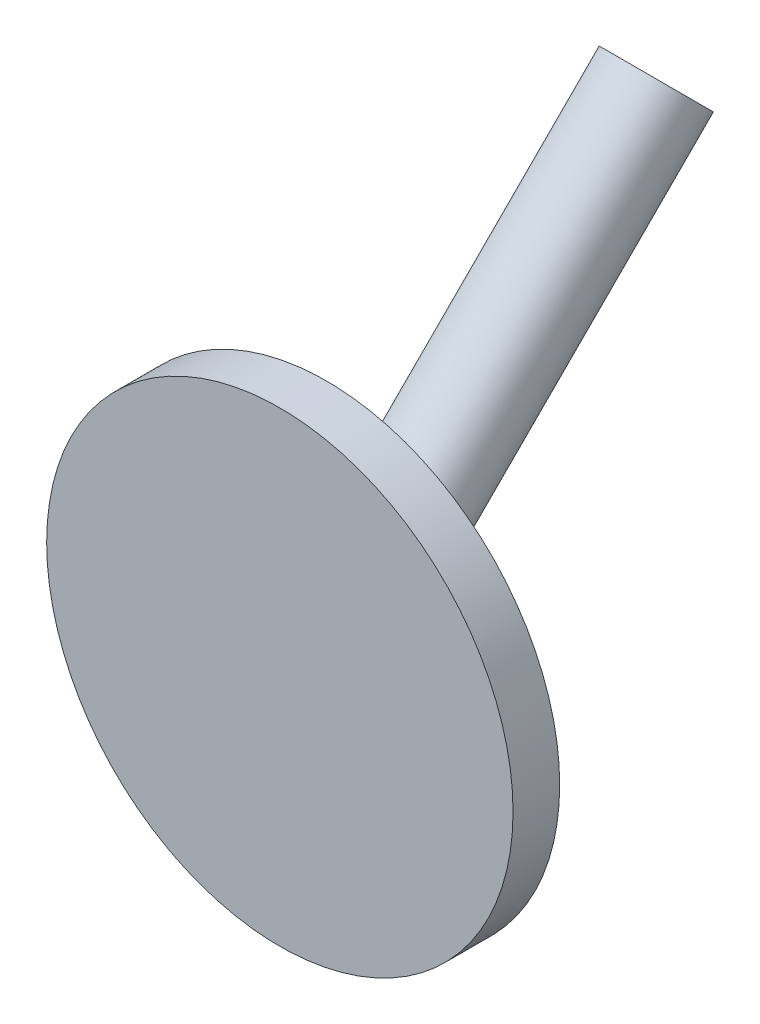
ISO-10303-21;
HEADER;
FILE_DESCRIPTION(('STEP AP214'),'2;1');
FILE_NAME('part.step','',(''),(''),'','','');
FILE_SCHEMA(('AUTOMOTIVE_DESIGN { 1 0 10303 214 1 1 1 1 }'));
ENDSEC;
DATA;
#1=APPLICATION_CONTEXT('core data for automotive mechanical design processes');
#2=APPLICATION_PROTOCOL_DEFINITION('international standard','automotive_design',2000,#1);
#3=PRODUCT_CONTEXT('',#1,'mechanical');
#4=PRODUCT('Part','Part','',(#3));
#5=PRODUCT_RELATED_PRODUCT_CATEGORY('part','',(#4));
#6=PRODUCT_DEFINITION_FORMATION('','',#4);
#7=PRODUCT_DEFINITION_CONTEXT('part definition',#1,'design');
#8=PRODUCT_DEFINITION('design','',#6,#7);
#9=PRODUCT_DEFINITION_SHAPE('','',#8);
#10=(LENGTH_UNIT() NAMED_UNIT(*) SI_UNIT(.MILLI.,.METRE.));
#11=(NAMED_UNIT(*) PLANE_ANGLE_UNIT() SI_UNIT($,.RADIAN.));
#12=(NAMED_UNIT(*) SI_UNIT($,.STERADIAN.) SOLID_ANGLE_UNIT());
#13=UNCERTAINTY_MEASURE_WITH_UNIT(LENGTH_MEASURE(1.E-05),#10,'distance_accuracy_value','');
#14=(GEOMETRIC_REPRESENTATION_CONTEXT(3) GLOBAL_UNCERTAINTY_ASSIGNED_CONTEXT((#13)) GLOBAL_UNIT_ASSIGNED_CONTEXT((#10,
#11,#12)) REPRESENTATION_CONTEXT('',''));
#15=CARTESIAN_POINT('',(0.,0.,0.));
#16=DIRECTION('',(0.,0.,1.));
#17=DIRECTION('',(1.,0.,0.));
#18=AXIS2_PLACEMENT_3D('',#15,#16,#17);
#19=CARTESIAN_POINT('',(0.,0.,0.));
#20=DIRECTION('',(0.,0.,1.));
#21=DIRECTION('',(1.,0.,0.));
#22=AXIS2_PLACEMENT_3D('',#19,#20,#21);
#23=PLANE('',#22);
#24=CARTESIAN_POINT('',(0.,0.,0.));
#25=DIRECTION('',(0.,0.,1.));
#26=DIRECTION('',(1.,0.,0.));
#27=AXIS2_PLACEMENT_3D('',#24,#25,#26);
#28=CIRCLE('',#27,10.);
#29=CARTESIAN_POINT('',(10.,0.,0.));
#30=VERTEX_POINT('',#29);
#31=EDGE_CURVE('E76',#30,#30,#28,.T.);
#32=ORIENTED_EDGE('',*,*,#31,.F.);
#33=EDGE_LOOP('',(#32));
#34=FACE_BOUND('',#33,.T.);
#35=CARTESIAN_POINT('',(0.,0.,0.));
#36=DIRECTION('',(0.,0.,1.));
#37=DIRECTION('',(0.,-1.,0.));
#38=AXIS2_PLACEMENT_3D('',#35,#36,#37);
#39=ELLIPSE('',#38,2.82842712474619,2.);
#40=CARTESIAN_POINT('',(-2.,0.,0.));
#41=VERTEX_POINT('',#40);
#42=CARTESIAN_POINT('',(2.,0.,0.));
#43=VERTEX_POINT('',#42);
#44=EDGE_CURVE('E60',#41,#43,#39,.F.);
#45=ORIENTED_EDGE('',*,*,#44,.F.);
#46=CARTESIAN_POINT('',(0.,0.,0.));
#47=DIRECTION('',(0.,0.,1.));
#48=DIRECTION('',(0.,1.,0.));
#49=AXIS2_PLACEMENT_3D('',#46,#47,#48);
#50=ELLIPSE('',#49,2.82842712474619,2.);
#51=EDGE_CURVE('E11',#43,#41,#50,.F.);
#52=ORIENTED_EDGE('',*,*,#51,.F.);
#53=EDGE_LOOP('',(#45,#52));
#54=FACE_BOUND('',#53,.T.);
#55=ADVANCED_FACE('F40',(#34,#54),#23,.F.);
#56=CARTESIAN_POINT('',(0.,-7.07106781186548,-7.07106781186548));
#57=DIRECTION('',(0.,0.707106781186548,0.707106781186548));
#58=DIRECTION('',(0.,-0.707106781186548,0.707106781186548));
#59=AXIS2_PLACEMENT_3D('',#56,#57,#58);
#60=CYLINDRICAL_SURFACE('',#59,2.);
#61=CARTESIAN_POINT('',(0.,-7.07106781186548,-7.07106781186548));
#62=DIRECTION('',(0.,-0.707106781186548,-0.707106781186548));
#63=DIRECTION('',(0.,0.707106781186548,-0.707106781186548));
#64=AXIS2_PLACEMENT_3D('',#61,#62,#63);
#65=CIRCLE('',#64,2.);
#66=CARTESIAN_POINT('',(0.,-5.65685424949238,-8.48528137423857));
#67=VERTEX_POINT('',#66);
#68=EDGE_CURVE('E63',#67,#67,#65,.T.);
#69=ORIENTED_EDGE('',*,*,#68,.F.);
#70=EDGE_LOOP('',(#69));
#71=FACE_BOUND('',#70,.T.);
#72=CARTESIAN_POINT('',(0.,0.,0.));
#73=DIRECTION('',(0.,1.,0.));
#74=DIRECTION('',(0.,0.,1.));
#75=AXIS2_PLACEMENT_3D('',#72,#73,#74);
#76=ELLIPSE('',#75,2.82842712474619,2.);
#77=EDGE_CURVE('E54',#43,#41,#76,.T.);
#78=ORIENTED_EDGE('',*,*,#77,.F.);
#79=ORIENTED_EDGE('',*,*,#51,.T.);
#80=EDGE_LOOP('',(#78,#79));
#81=FACE_BOUND('',#80,.T.);
#82=ADVANCED_FACE('F57',(#71,#81),#60,.T.);
#83=CARTESIAN_POINT('',(0.,0.,2.));
#84=DIRECTION('',(0.,0.,-1.));
#85=DIRECTION('',(-1.,0.,0.));
#86=AXIS2_PLACEMENT_3D('',#83,#84,#85);
#87=CYLINDRICAL_SURFACE('',#86,10.);
#88=CARTESIAN_POINT('',(0.,0.,2.));
#89=DIRECTION('',(0.,0.,1.));
#90=DIRECTION('',(1.,0.,0.));
#91=AXIS2_PLACEMENT_3D('',#88,#89,#90);
#92=CIRCLE('',#91,10.);
#93=CARTESIAN_POINT('',(10.,0.,2.));
#94=VERTEX_POINT('',#93);
#95=EDGE_CURVE('E49',#94,#94,#92,.T.);
#96=ORIENTED_EDGE('',*,*,#95,.F.);
#97=EDGE_LOOP('',(#96));
#98=FACE_BOUND('',#97,.T.);
#99=ORIENTED_EDGE('',*,*,#31,.T.);
#100=EDGE_LOOP('',(#99));
#101=FACE_BOUND('',#100,.T.);
#102=ADVANCED_FACE('F42',(#98,#101),#87,.T.);
#103=CARTESIAN_POINT('',(0.,0.,2.));
#104=DIRECTION('',(0.,0.,1.));
#105=DIRECTION('',(1.,0.,0.));
#106=AXIS2_PLACEMENT_3D('',#103,#104,#105);
#107=PLANE('',#106);
#108=ORIENTED_EDGE('',*,*,#95,.T.);
#109=EDGE_LOOP('',(#108));
#110=FACE_BOUND('',#109,.T.);
#111=ADVANCED_FACE('F91',(#110),#107,.T.);
#112=CARTESIAN_POINT('',(0.,-7.07106781186548,-7.07106781186548));
#113=DIRECTION('',(0.,-0.707106781186548,-0.707106781186548));
#114=DIRECTION('',(0.,0.707106781186548,-0.707106781186548));
#115=AXIS2_PLACEMENT_3D('',#112,#113,#114);
#116=PLANE('',#115);
#117=ORIENTED_EDGE('',*,*,#68,.T.);
#118=EDGE_LOOP('',(#117));
#119=FACE_BOUND('',#118,.T.);
#120=ADVANCED_FACE('F93',(#119),#116,.T.);
#121=CARTESIAN_POINT('',(0.,14.142135623731,-14.1421356237309));
#122=DIRECTION('',(0.,-0.707106781186548,0.707106781186547));
#123=DIRECTION('',(0.,-0.707106781186547,-0.707106781186548));
#124=AXIS2_PLACEMENT_3D('',#121,#122,#123);
#125=CYLINDRICAL_SURFACE('',#124,2.);
#126=CARTESIAN_POINT('',(0.,14.142135623731,-14.1421356237309));
#127=DIRECTION('',(0.,0.707106781186548,-0.707106781186547));
#128=DIRECTION('',(0.,0.707106781186547,0.707106781186548));
#129=AXIS2_PLACEMENT_3D('',#126,#127,#128);
#130=CIRCLE('',#129,2.);
#131=CARTESIAN_POINT('',(0.,15.556349186104,-12.7279220613579));
#132=VERTEX_POINT('',#131);
#133=EDGE_CURVE('E67',#132,#132,#130,.T.);
#134=ORIENTED_EDGE('',*,*,#133,.F.);
#135=EDGE_LOOP('',(#134));
#136=FACE_BOUND('',#135,.T.);
#137=ORIENTED_EDGE('',*,*,#77,.T.);
#138=ORIENTED_EDGE('',*,*,#44,.T.);
#139=EDGE_LOOP('',(#137,#138));
#140=FACE_BOUND('',#139,.T.);
#141=ADVANCED_FACE('F65',(#136,#140),#125,.T.);
#142=CARTESIAN_POINT('',(0.,14.142135623731,-14.1421356237309));
#143=DIRECTION('',(0.,0.707106781186548,-0.707106781186547));
#144=DIRECTION('',(0.,0.707106781186547,0.707106781186548));
#145=AXIS2_PLACEMENT_3D('',#142,#143,#144);
#146=PLANE('',#145);
#147=ORIENTED_EDGE('',*,*,#133,.T.);
#148=EDGE_LOOP('',(#147));
#149=FACE_BOUND('',#148,.T.);
#150=ADVANCED_FACE('F101',(#149),#146,.T.);
#151=CLOSED_SHELL('',(#55,#82,#102,#111,#120,#141,#150));
#152=MANIFOLD_SOLID_BREP('B2',#151);
#153=ADVANCED_BREP_SHAPE_REPRESENTATION('',(#18,#152),#14);
#154=SHAPE_DEFINITION_REPRESENTATION(#9,#153);
ENDSEC;
END-ISO-10303-21;
